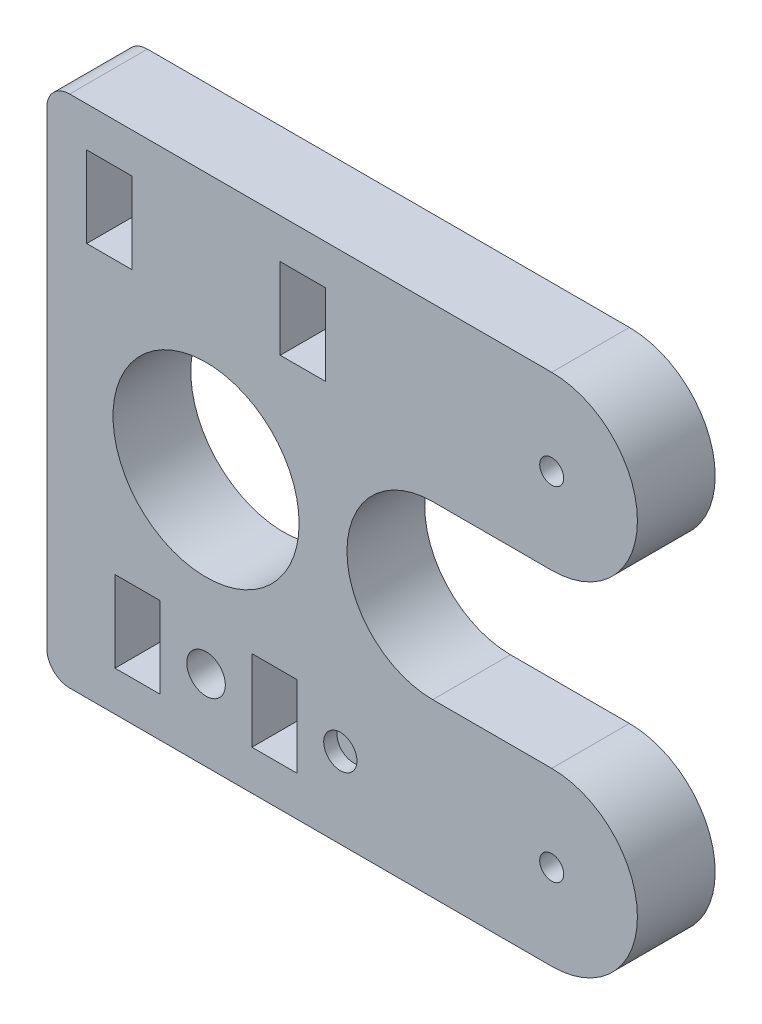
ISO-10303-21;
HEADER;
FILE_DESCRIPTION(('STEP AP214'),'2;1');
FILE_NAME('part.step','',(''),(''),'','','');
FILE_SCHEMA(('AUTOMOTIVE_DESIGN { 1 0 10303 214 1 1 1 1 }'));
ENDSEC;
DATA;
#1=APPLICATION_CONTEXT('core data for automotive mechanical design processes');
#2=APPLICATION_PROTOCOL_DEFINITION('international standard','automotive_design',2000,#1);
#3=PRODUCT_CONTEXT('',#1,'mechanical');
#4=PRODUCT('Part','Part','',(#3));
#5=PRODUCT_RELATED_PRODUCT_CATEGORY('part','',(#4));
#6=PRODUCT_DEFINITION_FORMATION('','',#4);
#7=PRODUCT_DEFINITION_CONTEXT('part definition',#1,'design');
#8=PRODUCT_DEFINITION('design','',#6,#7);
#9=PRODUCT_DEFINITION_SHAPE('','',#8);
#10=(LENGTH_UNIT() NAMED_UNIT(*) SI_UNIT(.MILLI.,.METRE.));
#11=(NAMED_UNIT(*) PLANE_ANGLE_UNIT() SI_UNIT($,.RADIAN.));
#12=(NAMED_UNIT(*) SI_UNIT($,.STERADIAN.) SOLID_ANGLE_UNIT());
#13=UNCERTAINTY_MEASURE_WITH_UNIT(LENGTH_MEASURE(1.E-05),#10,'distance_accuracy_value','');
#14=(GEOMETRIC_REPRESENTATION_CONTEXT(3) GLOBAL_UNCERTAINTY_ASSIGNED_CONTEXT((#13)) GLOBAL_UNIT_ASSIGNED_CONTEXT((#10,
#11,#12)) REPRESENTATION_CONTEXT('',''));
#15=CARTESIAN_POINT('',(0.,0.,0.));
#16=DIRECTION('',(0.,0.,1.));
#17=DIRECTION('',(1.,0.,0.));
#18=AXIS2_PLACEMENT_3D('',#15,#16,#17);
#19=CARTESIAN_POINT('',(684.72652137136,317.86545660983,5.85));
#20=DIRECTION('',(0.,0.,1.));
#21=DIRECTION('',(1.,0.,0.));
#22=AXIS2_PLACEMENT_3D('',#19,#20,#21);
#23=PLANE('',#22);
#24=CARTESIAN_POINT('',(668.82652137136,317.46545660983,5.85));
#25=DIRECTION('',(0.,0.,1.));
#26=DIRECTION('',(1.,0.,0.));
#27=AXIS2_PLACEMENT_3D('',#24,#25,#26);
#28=CIRCLE('',#27,1.24999999999996);
#29=CARTESIAN_POINT('',(670.07652137136,317.46545660983,5.85));
#30=VERTEX_POINT('',#29);
#31=EDGE_CURVE('E799',#30,#30,#28,.T.);
#32=ORIENTED_EDGE('',*,*,#31,.F.);
#33=EDGE_LOOP('',(#32));
#34=FACE_BOUND('',#33,.T.);
#35=CARTESIAN_POINT('',(658.72652137136,330.76545660983,5.85));
#36=DIRECTION('',(0.,0.,1.));
#37=DIRECTION('',(1.,0.,0.));
#38=AXIS2_PLACEMENT_3D('',#35,#36,#37);
#39=CIRCLE('',#38,7.00000000000004);
#40=CARTESIAN_POINT('',(665.72652137136,330.76545660983,5.85));
#41=VERTEX_POINT('',#40);
#42=EDGE_CURVE('E343',#41,#41,#39,.T.);
#43=ORIENTED_EDGE('',*,*,#42,.F.);
#44=EDGE_LOOP('',(#43));
#45=FACE_BOUND('',#44,.T.);
#46=CARTESIAN_POINT('',(684.72652137136,343.66545660983,5.85));
#47=DIRECTION('',(0.,0.,1.));
#48=DIRECTION('',(1.,0.,0.));
#49=AXIS2_PLACEMENT_3D('',#46,#47,#48);
#50=CIRCLE('',#49,0.900000000000007);
#51=CARTESIAN_POINT('',(685.62652137136,343.66545660983,5.85));
#52=VERTEX_POINT('',#51);
#53=EDGE_CURVE('E355',#52,#52,#50,.T.);
#54=ORIENTED_EDGE('',*,*,#53,.F.);
#55=EDGE_LOOP('',(#54));
#56=FACE_BOUND('',#55,.T.);
#57=DIRECTION('',(1.,0.,0.));
#58=VECTOR('',#57,1.);
#59=CARTESIAN_POINT('',(669.216844170212,311.41545660983,5.85));
#60=LINE('',#59,#58);
#61=CARTESIAN_POINT('',(648.463811899796,311.41545660983,5.85));
#62=VERTEX_POINT('',#61);
#63=CARTESIAN_POINT('',(684.726521371376,311.41545660983,5.85));
#64=VERTEX_POINT('',#63);
#65=EDGE_CURVE('E361',#62,#64,#60,.T.);
#66=ORIENTED_EDGE('',*,*,#65,.T.);
#67=CARTESIAN_POINT('',(684.72652137136,317.86545660983,5.85));
#68=DIRECTION('',(0.,0.,1.));
#69=DIRECTION('',(1.,0.,0.));
#70=AXIS2_PLACEMENT_3D('',#67,#68,#69);
#71=CIRCLE('',#70,6.44999999999996);
#72=CARTESIAN_POINT('',(684.726521371376,324.31545660983,5.85));
#73=VERTEX_POINT('',#72);
#74=EDGE_CURVE('E364',#64,#73,#71,.T.);
#75=ORIENTED_EDGE('',*,*,#74,.T.);
#76=DIRECTION('',(-1.,0.,0.));
#77=VECTOR('',#76,1.);
#78=CARTESIAN_POINT('',(684.726521371376,324.31545660983,5.85));
#79=LINE('',#78,#77);
#80=CARTESIAN_POINT('',(675.776521371359,324.31545660983,5.85));
#81=VERTEX_POINT('',#80);
#82=EDGE_CURVE('E367',#73,#81,#79,.T.);
#83=ORIENTED_EDGE('',*,*,#82,.T.);
#84=CARTESIAN_POINT('',(675.776521371359,330.76545660983,5.85));
#85=DIRECTION('',(0.,0.,-1.));
#86=DIRECTION('',(1.,0.,0.));
#87=AXIS2_PLACEMENT_3D('',#84,#85,#86);
#88=CIRCLE('',#87,6.45000000000007);
#89=CARTESIAN_POINT('',(675.776521371359,337.21545660983,5.85));
#90=VERTEX_POINT('',#89);
#91=EDGE_CURVE('E369',#81,#90,#88,.T.);
#92=ORIENTED_EDGE('',*,*,#91,.T.);
#93=DIRECTION('',(1.,0.,0.));
#94=VECTOR('',#93,1.);
#95=CARTESIAN_POINT('',(684.726521371376,337.21545660983,5.85));
#96=LINE('',#95,#94);
#97=CARTESIAN_POINT('',(684.726521371376,337.21545660983,5.85));
#98=VERTEX_POINT('',#97);
#99=EDGE_CURVE('E371',#90,#98,#96,.T.);
#100=ORIENTED_EDGE('',*,*,#99,.T.);
#101=CARTESIAN_POINT('',(684.72652137136,343.66545660983,5.85));
#102=DIRECTION('',(0.,0.,1.));
#103=DIRECTION('',(-1.,0.,0.));
#104=AXIS2_PLACEMENT_3D('',#101,#102,#103);
#105=CIRCLE('',#104,6.44999999999996);
#106=CARTESIAN_POINT('',(684.726521371376,350.11545660983,5.85));
#107=VERTEX_POINT('',#106);
#108=EDGE_CURVE('E373',#98,#107,#105,.T.);
#109=ORIENTED_EDGE('',*,*,#108,.T.);
#110=DIRECTION('',(-1.,0.,0.));
#111=VECTOR('',#110,1.);
#112=CARTESIAN_POINT('',(669.21684417021,350.11545660983,5.85));
#113=LINE('',#112,#111);
#114=CARTESIAN_POINT('',(648.463811899796,350.11545660983,5.85));
#115=VERTEX_POINT('',#114);
#116=EDGE_CURVE('E375',#107,#115,#113,.T.);
#117=ORIENTED_EDGE('',*,*,#116,.T.);
#118=CARTESIAN_POINT('',(648.463811899796,348.398155081394,5.85));
#119=DIRECTION('',(0.,0.,1.));
#120=DIRECTION('',(1.,0.,0.));
#121=AXIS2_PLACEMENT_3D('',#118,#119,#120);
#122=CIRCLE('',#121,1.71730152843566);
#123=CARTESIAN_POINT('',(646.74651037136,348.398155081394,5.85));
#124=VERTEX_POINT('',#123);
#125=EDGE_CURVE('E377',#115,#124,#122,.T.);
#126=ORIENTED_EDGE('',*,*,#125,.T.);
#127=DIRECTION('',(0.,-1.,0.));
#128=VECTOR('',#127,1.);
#129=CARTESIAN_POINT('',(646.74651037136,348.398155081394,5.85));
#130=LINE('',#129,#128);
#131=CARTESIAN_POINT('',(646.74651037136,313.132758138266,5.85));
#132=VERTEX_POINT('',#131);
#133=EDGE_CURVE('E379',#124,#132,#130,.T.);
#134=ORIENTED_EDGE('',*,*,#133,.T.);
#135=CARTESIAN_POINT('',(648.463811899796,313.132758138266,5.85));
#136=DIRECTION('',(0.,0.,1.));
#137=DIRECTION('',(1.,0.,0.));
#138=AXIS2_PLACEMENT_3D('',#135,#136,#137);
#139=CIRCLE('',#138,1.71730152843566);
#140=EDGE_CURVE('E381',#132,#62,#139,.T.);
#141=ORIENTED_EDGE('',*,*,#140,.T.);
#142=EDGE_LOOP('',(#66,#75,#83,#92,#100,#109,#117,#126,#134,#141));
#143=FACE_BOUND('',#142,.T.);
#144=CARTESIAN_POINT('',(658.72652137136,317.46545660983,5.85));
#145=DIRECTION('',(0.,0.,1.));
#146=DIRECTION('',(1.,0.,0.));
#147=AXIS2_PLACEMENT_3D('',#144,#145,#146);
#148=CIRCLE('',#147,1.44999999999994);
#149=CARTESIAN_POINT('',(660.17652137136,317.46545660983,5.85));
#150=VERTEX_POINT('',#149);
#151=EDGE_CURVE('E349',#150,#150,#148,.T.);
#152=ORIENTED_EDGE('',*,*,#151,.F.);
#153=EDGE_LOOP('',(#152));
#154=FACE_BOUND('',#153,.T.);
#155=CARTESIAN_POINT('',(684.72652137136,317.86545660983,5.85));
#156=DIRECTION('',(0.,0.,1.));
#157=DIRECTION('',(1.,0.,0.));
#158=AXIS2_PLACEMENT_3D('',#155,#156,#157);
#159=CIRCLE('',#158,0.900000000000007);
#160=CARTESIAN_POINT('',(685.62652137136,317.86545660983,5.85));
#161=VERTEX_POINT('',#160);
#162=EDGE_CURVE('E337',#161,#161,#159,.T.);
#163=ORIENTED_EDGE('',*,*,#162,.F.);
#164=EDGE_LOOP('',(#163));
#165=FACE_BOUND('',#164,.T.);
#166=DIRECTION('',(0.,1.,0.));
#167=VECTOR('',#166,1.);
#168=CARTESIAN_POINT('',(653.14652137136,341.01545660983,5.85));
#169=LINE('',#168,#167);
#170=CARTESIAN_POINT('',(653.14652137136,341.01545660983,5.85));
#171=VERTEX_POINT('',#170);
#172=CARTESIAN_POINT('',(653.14652137136,347.11545660983,5.85));
#173=VERTEX_POINT('',#172);
#174=EDGE_CURVE('E308',#171,#173,#169,.T.);
#175=ORIENTED_EDGE('',*,*,#174,.F.);
#176=DIRECTION('',(1.,0.,0.));
#177=VECTOR('',#176,1.);
#178=CARTESIAN_POINT('',(649.74651037136,341.01545660983,5.85));
#179=LINE('',#178,#177);
#180=CARTESIAN_POINT('',(649.74651037136,341.01545660983,5.85));
#181=VERTEX_POINT('',#180);
#182=EDGE_CURVE('E306',#181,#171,#179,.T.);
#183=ORIENTED_EDGE('',*,*,#182,.F.);
#184=DIRECTION('',(0.,-1.,0.));
#185=VECTOR('',#184,1.);
#186=CARTESIAN_POINT('',(649.74651037136,347.11545660983,5.85));
#187=LINE('',#186,#185);
#188=CARTESIAN_POINT('',(649.74651037136,347.11545660983,5.85));
#189=VERTEX_POINT('',#188);
#190=EDGE_CURVE('E314',#189,#181,#187,.T.);
#191=ORIENTED_EDGE('',*,*,#190,.F.);
#192=DIRECTION('',(-1.,0.,0.));
#193=VECTOR('',#192,1.);
#194=CARTESIAN_POINT('',(653.14652137136,347.11545660983,5.85));
#195=LINE('',#194,#193);
#196=EDGE_CURVE('E311',#173,#189,#195,.T.);
#197=ORIENTED_EDGE('',*,*,#196,.F.);
#198=EDGE_LOOP('',(#175,#183,#191,#197));
#199=FACE_BOUND('',#198,.T.);
#200=DIRECTION('',(1.,0.,0.));
#201=VECTOR('',#200,1.);
#202=CARTESIAN_POINT('',(651.87652137136,314.41545660983,5.85));
#203=LINE('',#202,#201);
#204=CARTESIAN_POINT('',(651.87652137136,314.41545660983,5.85));
#205=VERTEX_POINT('',#204);
#206=CARTESIAN_POINT('',(655.27652137136,314.41545660983,5.85));
#207=VERTEX_POINT('',#206);
#208=EDGE_CURVE('E277',#205,#207,#203,.T.);
#209=ORIENTED_EDGE('',*,*,#208,.F.);
#210=DIRECTION('',(0.,-1.,0.));
#211=VECTOR('',#210,1.);
#212=CARTESIAN_POINT('',(651.87652137136,320.51545660983,5.85));
#213=LINE('',#212,#211);
#214=CARTESIAN_POINT('',(651.87652137136,320.51545660983,5.85));
#215=VERTEX_POINT('',#214);
#216=EDGE_CURVE('E275',#215,#205,#213,.T.);
#217=ORIENTED_EDGE('',*,*,#216,.F.);
#218=DIRECTION('',(-1.,0.,0.));
#219=VECTOR('',#218,1.);
#220=CARTESIAN_POINT('',(655.27652137136,320.51545660983,5.85));
#221=LINE('',#220,#219);
#222=CARTESIAN_POINT('',(655.27652137136,320.51545660983,5.85));
#223=VERTEX_POINT('',#222);
#224=EDGE_CURVE('E283',#223,#215,#221,.T.);
#225=ORIENTED_EDGE('',*,*,#224,.F.);
#226=DIRECTION('',(0.,1.,0.));
#227=VECTOR('',#226,1.);
#228=CARTESIAN_POINT('',(655.27652137136,314.41545660983,5.85));
#229=LINE('',#228,#227);
#230=EDGE_CURVE('E280',#207,#223,#229,.T.);
#231=ORIENTED_EDGE('',*,*,#230,.F.);
#232=EDGE_LOOP('',(#209,#217,#225,#231));
#233=FACE_BOUND('',#232,.T.);
#234=DIRECTION('',(0.,1.,0.));
#235=VECTOR('',#234,1.);
#236=CARTESIAN_POINT('',(667.70653237136,341.01545660983,5.85));
#237=LINE('',#236,#235);
#238=CARTESIAN_POINT('',(667.70653237136,341.01545660983,5.85));
#239=VERTEX_POINT('',#238);
#240=CARTESIAN_POINT('',(667.70653237136,347.11545660983,5.85));
#241=VERTEX_POINT('',#240);
#242=EDGE_CURVE('E246',#239,#241,#237,.T.);
#243=ORIENTED_EDGE('',*,*,#242,.F.);
#244=DIRECTION('',(1.,0.,0.));
#245=VECTOR('',#244,1.);
#246=CARTESIAN_POINT('',(664.30652137136,341.01545660983,5.85));
#247=LINE('',#246,#245);
#248=CARTESIAN_POINT('',(664.30652137136,341.01545660983,5.85));
#249=VERTEX_POINT('',#248);
#250=EDGE_CURVE('E244',#249,#239,#247,.T.);
#251=ORIENTED_EDGE('',*,*,#250,.F.);
#252=DIRECTION('',(0.,-1.,0.));
#253=VECTOR('',#252,1.);
#254=CARTESIAN_POINT('',(664.30652137136,347.11545660983,5.85));
#255=LINE('',#254,#253);
#256=CARTESIAN_POINT('',(664.30652137136,347.11545660983,5.85));
#257=VERTEX_POINT('',#256);
#258=EDGE_CURVE('E252',#257,#249,#255,.T.);
#259=ORIENTED_EDGE('',*,*,#258,.F.);
#260=DIRECTION('',(-1.,0.,0.));
#261=VECTOR('',#260,1.);
#262=CARTESIAN_POINT('',(667.70653237136,347.11545660983,5.85));
#263=LINE('',#262,#261);
#264=EDGE_CURVE('E249',#241,#257,#263,.T.);
#265=ORIENTED_EDGE('',*,*,#264,.F.);
#266=EDGE_LOOP('',(#243,#251,#259,#265));
#267=FACE_BOUND('',#266,.T.);
#268=DIRECTION('',(0.,-1.,0.));
#269=VECTOR('',#268,1.);
#270=CARTESIAN_POINT('',(662.17652137136,320.51545660983,5.85));
#271=LINE('',#270,#269);
#272=CARTESIAN_POINT('',(662.17652137136,320.51545660983,5.85));
#273=VERTEX_POINT('',#272);
#274=CARTESIAN_POINT('',(662.17652137136,314.41545660983,5.85));
#275=VERTEX_POINT('',#274);
#276=EDGE_CURVE('E214',#273,#275,#271,.T.);
#277=ORIENTED_EDGE('',*,*,#276,.F.);
#278=DIRECTION('',(-1.,0.,0.));
#279=VECTOR('',#278,1.);
#280=CARTESIAN_POINT('',(665.57652137136,320.51545660983,5.85));
#281=LINE('',#280,#279);
#282=CARTESIAN_POINT('',(665.57652137136,320.51545660983,5.85));
#283=VERTEX_POINT('',#282);
#284=EDGE_CURVE('E206',#283,#273,#281,.T.);
#285=ORIENTED_EDGE('',*,*,#284,.F.);
#286=DIRECTION('',(0.,1.,0.));
#287=VECTOR('',#286,1.);
#288=CARTESIAN_POINT('',(665.57652137136,314.41545660983,5.85));
#289=LINE('',#288,#287);
#290=CARTESIAN_POINT('',(665.57652137136,314.41545660983,5.85));
#291=VERTEX_POINT('',#290);
#292=EDGE_CURVE('E228',#291,#283,#289,.T.);
#293=ORIENTED_EDGE('',*,*,#292,.F.);
#294=DIRECTION('',(1.,0.,0.));
#295=VECTOR('',#294,1.);
#296=CARTESIAN_POINT('',(662.17652137136,314.41545660983,5.85));
#297=LINE('',#296,#295);
#298=EDGE_CURVE('E226',#275,#291,#297,.T.);
#299=ORIENTED_EDGE('',*,*,#298,.F.);
#300=EDGE_LOOP('',(#277,#285,#293,#299));
#301=FACE_BOUND('',#300,.T.);
#302=ADVANCED_FACE('F33',(#34,#45,#56,#143,#154,#165,#199,#233,#267,#301),#23,.T.);
#303=CARTESIAN_POINT('',(684.72652137136,317.86545660983,0.));
#304=DIRECTION('',(0.,0.,1.));
#305=DIRECTION('',(1.,0.,0.));
#306=AXIS2_PLACEMENT_3D('',#303,#304,#305);
#307=PLANE('',#306);
#308=DIRECTION('',(1.,0.,0.));
#309=VECTOR('',#308,1.);
#310=CARTESIAN_POINT('',(664.30652137136,341.01545660983,0.));
#311=LINE('',#310,#309);
#312=CARTESIAN_POINT('',(664.30652137136,341.01545660983,0.));
#313=VERTEX_POINT('',#312);
#314=CARTESIAN_POINT('',(667.70653237136,341.01545660983,0.));
#315=VERTEX_POINT('',#314);
#316=EDGE_CURVE('E222',#313,#315,#311,.T.);
#317=ORIENTED_EDGE('',*,*,#316,.T.);
#318=DIRECTION('',(0.,1.,0.));
#319=VECTOR('',#318,1.);
#320=CARTESIAN_POINT('',(667.70653237136,341.01545660983,0.));
#321=LINE('',#320,#319);
#322=CARTESIAN_POINT('',(667.70653237136,347.11545660983,0.));
#323=VERTEX_POINT('',#322);
#324=EDGE_CURVE('E257',#315,#323,#321,.T.);
#325=ORIENTED_EDGE('',*,*,#324,.T.);
#326=DIRECTION('',(-1.,0.,0.));
#327=VECTOR('',#326,1.);
#328=CARTESIAN_POINT('',(667.70653237136,347.11545660983,0.));
#329=LINE('',#328,#327);
#330=CARTESIAN_POINT('',(664.30652137136,347.11545660983,0.));
#331=VERTEX_POINT('',#330);
#332=EDGE_CURVE('E260',#323,#331,#329,.T.);
#333=ORIENTED_EDGE('',*,*,#332,.T.);
#334=DIRECTION('',(0.,-1.,0.));
#335=VECTOR('',#334,1.);
#336=CARTESIAN_POINT('',(664.30652137136,347.11545660983,0.));
#337=LINE('',#336,#335);
#338=EDGE_CURVE('E247',#331,#313,#337,.T.);
#339=ORIENTED_EDGE('',*,*,#338,.T.);
#340=EDGE_LOOP('',(#317,#325,#333,#339));
#341=FACE_BOUND('',#340,.T.);
#342=DIRECTION('',(1.,0.,0.));
#343=VECTOR('',#342,1.);
#344=CARTESIAN_POINT('',(649.74651037136,341.01545660983,0.));
#345=LINE('',#344,#343);
#346=CARTESIAN_POINT('',(649.74651037136,341.01545660983,0.));
#347=VERTEX_POINT('',#346);
#348=CARTESIAN_POINT('',(653.14652137136,341.01545660983,0.));
#349=VERTEX_POINT('',#348);
#350=EDGE_CURVE('E305',#347,#349,#345,.T.);
#351=ORIENTED_EDGE('',*,*,#350,.T.);
#352=DIRECTION('',(0.,1.,0.));
#353=VECTOR('',#352,1.);
#354=CARTESIAN_POINT('',(653.14652137136,341.01545660983,0.));
#355=LINE('',#354,#353);
#356=CARTESIAN_POINT('',(653.14652137136,347.11545660983,0.));
#357=VERTEX_POINT('',#356);
#358=EDGE_CURVE('E319',#349,#357,#355,.T.);
#359=ORIENTED_EDGE('',*,*,#358,.T.);
#360=DIRECTION('',(-1.,0.,0.));
#361=VECTOR('',#360,1.);
#362=CARTESIAN_POINT('',(653.14652137136,347.11545660983,0.));
#363=LINE('',#362,#361);
#364=CARTESIAN_POINT('',(649.74651037136,347.11545660983,0.));
#365=VERTEX_POINT('',#364);
#366=EDGE_CURVE('E322',#357,#365,#363,.T.);
#367=ORIENTED_EDGE('',*,*,#366,.T.);
#368=DIRECTION('',(0.,-1.,0.));
#369=VECTOR('',#368,1.);
#370=CARTESIAN_POINT('',(649.74651037136,347.11545660983,0.));
#371=LINE('',#370,#369);
#372=EDGE_CURVE('E309',#365,#347,#371,.T.);
#373=ORIENTED_EDGE('',*,*,#372,.T.);
#374=EDGE_LOOP('',(#351,#359,#367,#373));
#375=FACE_BOUND('',#374,.T.);
#376=CARTESIAN_POINT('',(684.72652137136,317.86545660983,0.));
#377=DIRECTION('',(0.,0.,1.));
#378=DIRECTION('',(1.,0.,0.));
#379=AXIS2_PLACEMENT_3D('',#376,#377,#378);
#380=CIRCLE('',#379,6.44999999999996);
#381=CARTESIAN_POINT('',(684.726521371376,311.41545660983,0.));
#382=VERTEX_POINT('',#381);
#383=CARTESIAN_POINT('',(684.726521371376,324.31545660983,0.));
#384=VERTEX_POINT('',#383);
#385=EDGE_CURVE('E358',#382,#384,#380,.T.);
#386=ORIENTED_EDGE('',*,*,#385,.F.);
#387=DIRECTION('',(1.,0.,0.));
#388=VECTOR('',#387,1.);
#389=CARTESIAN_POINT('',(648.463811899796,311.41545660983,0.));
#390=LINE('',#389,#388);
#391=CARTESIAN_POINT('',(648.463811899796,311.41545660983,0.));
#392=VERTEX_POINT('',#391);
#393=EDGE_CURVE('E365',#392,#382,#390,.T.);
#394=ORIENTED_EDGE('',*,*,#393,.F.);
#395=CARTESIAN_POINT('',(648.463811899796,313.132758138266,0.));
#396=DIRECTION('',(0.,0.,1.));
#397=DIRECTION('',(1.,0.,0.));
#398=AXIS2_PLACEMENT_3D('',#395,#396,#397);
#399=CIRCLE('',#398,1.71730152843566);
#400=CARTESIAN_POINT('',(646.74651037136,313.132758138266,0.));
#401=VERTEX_POINT('',#400);
#402=EDGE_CURVE('E401',#401,#392,#399,.T.);
#403=ORIENTED_EDGE('',*,*,#402,.F.);
#404=DIRECTION('',(0.,-1.,0.));
#405=VECTOR('',#404,1.);
#406=CARTESIAN_POINT('',(646.74651037136,348.398155081394,0.));
#407=LINE('',#406,#405);
#408=CARTESIAN_POINT('',(646.74651037136,348.398155081394,0.));
#409=VERTEX_POINT('',#408);
#410=EDGE_CURVE('E399',#409,#401,#407,.T.);
#411=ORIENTED_EDGE('',*,*,#410,.F.);
#412=CARTESIAN_POINT('',(648.463811899796,348.398155081394,0.));
#413=DIRECTION('',(0.,0.,1.));
#414=DIRECTION('',(1.,0.,0.));
#415=AXIS2_PLACEMENT_3D('',#412,#413,#414);
#416=CIRCLE('',#415,1.71730152843566);
#417=CARTESIAN_POINT('',(648.463811899796,350.11545660983,0.));
#418=VERTEX_POINT('',#417);
#419=EDGE_CURVE('E397',#418,#409,#416,.T.);
#420=ORIENTED_EDGE('',*,*,#419,.F.);
#421=DIRECTION('',(-1.,0.,0.));
#422=VECTOR('',#421,1.);
#423=CARTESIAN_POINT('',(669.21684417021,350.11545660983,0.));
#424=LINE('',#423,#422);
#425=CARTESIAN_POINT('',(684.726521371376,350.11545660983,0.));
#426=VERTEX_POINT('',#425);
#427=EDGE_CURVE('E395',#426,#418,#424,.T.);
#428=ORIENTED_EDGE('',*,*,#427,.F.);
#429=CARTESIAN_POINT('',(684.72652137136,343.66545660983,0.));
#430=DIRECTION('',(0.,0.,1.));
#431=DIRECTION('',(-1.,0.,0.));
#432=AXIS2_PLACEMENT_3D('',#429,#430,#431);
#433=CIRCLE('',#432,6.44999999999996);
#434=CARTESIAN_POINT('',(684.726521371376,337.21545660983,0.));
#435=VERTEX_POINT('',#434);
#436=EDGE_CURVE('E392',#435,#426,#433,.T.);
#437=ORIENTED_EDGE('',*,*,#436,.F.);
#438=DIRECTION('',(1.,0.,0.));
#439=VECTOR('',#438,1.);
#440=CARTESIAN_POINT('',(684.726521371376,337.21545660983,0.));
#441=LINE('',#440,#439);
#442=CARTESIAN_POINT('',(675.776521371359,337.21545660983,0.));
#443=VERTEX_POINT('',#442);
#444=EDGE_CURVE('E390',#443,#435,#441,.T.);
#445=ORIENTED_EDGE('',*,*,#444,.F.);
#446=CARTESIAN_POINT('',(675.776521371359,330.76545660983,0.));
#447=DIRECTION('',(0.,0.,-1.));
#448=DIRECTION('',(1.,0.,0.));
#449=AXIS2_PLACEMENT_3D('',#446,#447,#448);
#450=CIRCLE('',#449,6.45000000000007);
#451=CARTESIAN_POINT('',(675.776521371359,324.31545660983,0.));
#452=VERTEX_POINT('',#451);
#453=EDGE_CURVE('E388',#452,#443,#450,.T.);
#454=ORIENTED_EDGE('',*,*,#453,.F.);
#455=DIRECTION('',(-1.,0.,0.));
#456=VECTOR('',#455,1.);
#457=CARTESIAN_POINT('',(684.726521371376,324.31545660983,0.));
#458=LINE('',#457,#456);
#459=EDGE_CURVE('E386',#384,#452,#458,.T.);
#460=ORIENTED_EDGE('',*,*,#459,.F.);
#461=EDGE_LOOP('',(#386,#394,#403,#411,#420,#428,#437,#445,#454,#460));
#462=FACE_BOUND('',#461,.T.);
#463=CARTESIAN_POINT('',(684.72652137136,343.66545660983,0.));
#464=DIRECTION('',(0.,0.,1.));
#465=DIRECTION('',(1.,0.,0.));
#466=AXIS2_PLACEMENT_3D('',#463,#464,#465);
#467=CIRCLE('',#466,0.900000000000007);
#468=CARTESIAN_POINT('',(685.62652137136,343.66545660983,0.));
#469=VERTEX_POINT('',#468);
#470=EDGE_CURVE('E352',#469,#469,#467,.T.);
#471=ORIENTED_EDGE('',*,*,#470,.T.);
#472=EDGE_LOOP('',(#471));
#473=FACE_BOUND('',#472,.T.);
#474=CARTESIAN_POINT('',(658.72652137136,317.46545660983,0.));
#475=DIRECTION('',(0.,0.,1.));
#476=DIRECTION('',(1.,0.,0.));
#477=AXIS2_PLACEMENT_3D('',#474,#475,#476);
#478=CIRCLE('',#477,1.44999999999994);
#479=CARTESIAN_POINT('',(660.17652137136,317.46545660983,0.));
#480=VERTEX_POINT('',#479);
#481=EDGE_CURVE('E346',#480,#480,#478,.T.);
#482=ORIENTED_EDGE('',*,*,#481,.T.);
#483=EDGE_LOOP('',(#482));
#484=FACE_BOUND('',#483,.T.);
#485=CARTESIAN_POINT('',(658.72652137136,330.76545660983,0.));
#486=DIRECTION('',(0.,0.,1.));
#487=DIRECTION('',(1.,0.,0.));
#488=AXIS2_PLACEMENT_3D('',#485,#486,#487);
#489=CIRCLE('',#488,7.00000000000004);
#490=CARTESIAN_POINT('',(665.72652137136,330.76545660983,0.));
#491=VERTEX_POINT('',#490);
#492=EDGE_CURVE('E340',#491,#491,#489,.T.);
#493=ORIENTED_EDGE('',*,*,#492,.T.);
#494=EDGE_LOOP('',(#493));
#495=FACE_BOUND('',#494,.T.);
#496=CARTESIAN_POINT('',(684.72652137136,317.86545660983,0.));
#497=DIRECTION('',(0.,0.,1.));
#498=DIRECTION('',(1.,0.,0.));
#499=AXIS2_PLACEMENT_3D('',#496,#497,#498);
#500=CIRCLE('',#499,0.900000000000007);
#501=CARTESIAN_POINT('',(685.62652137136,317.86545660983,0.));
#502=VERTEX_POINT('',#501);
#503=EDGE_CURVE('E336',#502,#502,#500,.T.);
#504=ORIENTED_EDGE('',*,*,#503,.T.);
#505=EDGE_LOOP('',(#504));
#506=FACE_BOUND('',#505,.T.);
#507=DIRECTION('',(0.,-1.,0.));
#508=VECTOR('',#507,1.);
#509=CARTESIAN_POINT('',(651.87652137136,320.51545660983,0.));
#510=LINE('',#509,#508);
#511=CARTESIAN_POINT('',(651.87652137136,320.51545660983,0.));
#512=VERTEX_POINT('',#511);
#513=CARTESIAN_POINT('',(651.87652137136,314.41545660983,0.));
#514=VERTEX_POINT('',#513);
#515=EDGE_CURVE('E274',#512,#514,#510,.T.);
#516=ORIENTED_EDGE('',*,*,#515,.T.);
#517=DIRECTION('',(1.,0.,0.));
#518=VECTOR('',#517,1.);
#519=CARTESIAN_POINT('',(651.87652137136,314.41545660983,0.));
#520=LINE('',#519,#518);
#521=CARTESIAN_POINT('',(655.27652137136,314.41545660983,0.));
#522=VERTEX_POINT('',#521);
#523=EDGE_CURVE('E288',#514,#522,#520,.T.);
#524=ORIENTED_EDGE('',*,*,#523,.T.);
#525=DIRECTION('',(0.,1.,0.));
#526=VECTOR('',#525,1.);
#527=CARTESIAN_POINT('',(655.27652137136,314.41545660983,0.));
#528=LINE('',#527,#526);
#529=CARTESIAN_POINT('',(655.27652137136,320.51545660983,0.));
#530=VERTEX_POINT('',#529);
#531=EDGE_CURVE('E291',#522,#530,#528,.T.);
#532=ORIENTED_EDGE('',*,*,#531,.T.);
#533=DIRECTION('',(-1.,0.,0.));
#534=VECTOR('',#533,1.);
#535=CARTESIAN_POINT('',(655.27652137136,320.51545660983,0.));
#536=LINE('',#535,#534);
#537=EDGE_CURVE('E278',#530,#512,#536,.T.);
#538=ORIENTED_EDGE('',*,*,#537,.T.);
#539=EDGE_LOOP('',(#516,#524,#532,#538));
#540=FACE_BOUND('',#539,.T.);
#541=DIRECTION('',(-1.,0.,0.));
#542=VECTOR('',#541,1.);
#543=CARTESIAN_POINT('',(665.57652137136,320.51545660983,0.));
#544=LINE('',#543,#542);
#545=CARTESIAN_POINT('',(665.57652137136,320.51545660983,0.));
#546=VERTEX_POINT('',#545);
#547=CARTESIAN_POINT('',(662.17652137136,320.51545660983,0.));
#548=VERTEX_POINT('',#547);
#549=EDGE_CURVE('E56',#546,#548,#544,.T.);
#550=ORIENTED_EDGE('',*,*,#549,.T.);
#551=DIRECTION('',(0.,-1.,0.));
#552=VECTOR('',#551,1.);
#553=CARTESIAN_POINT('',(662.17652137136,320.51545660983,0.));
#554=LINE('',#553,#552);
#555=CARTESIAN_POINT('',(662.17652137136,314.41545660983,0.));
#556=VERTEX_POINT('',#555);
#557=EDGE_CURVE('E221',#548,#556,#554,.T.);
#558=ORIENTED_EDGE('',*,*,#557,.T.);
#559=DIRECTION('',(1.,0.,0.));
#560=VECTOR('',#559,1.);
#561=CARTESIAN_POINT('',(662.17652137136,314.41545660983,0.));
#562=LINE('',#561,#560);
#563=CARTESIAN_POINT('',(665.57652137136,314.41545660983,0.));
#564=VERTEX_POINT('',#563);
#565=EDGE_CURVE('E236',#556,#564,#562,.T.);
#566=ORIENTED_EDGE('',*,*,#565,.T.);
#567=DIRECTION('',(0.,1.,0.));
#568=VECTOR('',#567,1.);
#569=CARTESIAN_POINT('',(665.57652137136,314.41545660983,0.));
#570=LINE('',#569,#568);
#571=EDGE_CURVE('E215',#564,#546,#570,.T.);
#572=ORIENTED_EDGE('',*,*,#571,.T.);
#573=EDGE_LOOP('',(#550,#558,#566,#572));
#574=FACE_BOUND('',#573,.T.);
#575=ADVANCED_FACE('F437',(#341,#375,#462,#473,#484,#495,#506,#540,#574),#307,.F.);
#576=CARTESIAN_POINT('',(684.72652137136,317.86545660983,5.85));
#577=DIRECTION('',(0.,0.,-1.));
#578=DIRECTION('',(-1.,0.,0.));
#579=AXIS2_PLACEMENT_3D('',#576,#577,#578);
#580=CYLINDRICAL_SURFACE('',#579,6.44999999999996);
#581=ORIENTED_EDGE('',*,*,#385,.T.);
#582=DIRECTION('',(0.,0.,-1.));
#583=VECTOR('',#582,1.);
#584=CARTESIAN_POINT('',(684.726521371376,324.31545660983,5.85));
#585=LINE('',#584,#583);
#586=EDGE_CURVE('E41',#73,#384,#585,.T.);
#587=ORIENTED_EDGE('',*,*,#586,.F.);
#588=ORIENTED_EDGE('',*,*,#74,.F.);
#589=DIRECTION('',(0.,0.,-1.));
#590=VECTOR('',#589,1.);
#591=CARTESIAN_POINT('',(684.726521371376,311.41545660983,5.85));
#592=LINE('',#591,#590);
#593=EDGE_CURVE('E11',#64,#382,#592,.T.);
#594=ORIENTED_EDGE('',*,*,#593,.T.);
#595=EDGE_LOOP('',(#581,#587,#588,#594));
#596=FACE_BOUND('',#595,.T.);
#597=ADVANCED_FACE('F35',(#596),#580,.T.);
#598=CARTESIAN_POINT('',(684.726521371376,324.31545660983,5.85));
#599=DIRECTION('',(0.,-1.,0.));
#600=DIRECTION('',(0.,0.,-1.));
#601=AXIS2_PLACEMENT_3D('',#598,#599,#600);
#602=PLANE('',#601);
#603=ORIENTED_EDGE('',*,*,#459,.T.);
#604=DIRECTION('',(0.,0.,-1.));
#605=VECTOR('',#604,1.);
#606=CARTESIAN_POINT('',(675.776521371359,324.31545660983,5.85));
#607=LINE('',#606,#605);
#608=EDGE_CURVE('E424',#81,#452,#607,.T.);
#609=ORIENTED_EDGE('',*,*,#608,.F.);
#610=ORIENTED_EDGE('',*,*,#82,.F.);
#611=ORIENTED_EDGE('',*,*,#586,.T.);
#612=EDGE_LOOP('',(#603,#609,#610,#611));
#613=FACE_BOUND('',#612,.T.);
#614=ADVANCED_FACE('F431',(#613),#602,.F.);
#615=CARTESIAN_POINT('',(675.776521371359,330.76545660983,5.85));
#616=DIRECTION('',(0.,0.,-1.));
#617=DIRECTION('',(-1.,0.,0.));
#618=AXIS2_PLACEMENT_3D('',#615,#616,#617);
#619=CYLINDRICAL_SURFACE('',#618,6.45000000000007);
#620=ORIENTED_EDGE('',*,*,#453,.T.);
#621=DIRECTION('',(0.,0.,-1.));
#622=VECTOR('',#621,1.);
#623=CARTESIAN_POINT('',(675.776521371359,337.21545660983,5.85));
#624=LINE('',#623,#622);
#625=EDGE_CURVE('E421',#90,#443,#624,.T.);
#626=ORIENTED_EDGE('',*,*,#625,.F.);
#627=ORIENTED_EDGE('',*,*,#91,.F.);
#628=ORIENTED_EDGE('',*,*,#608,.T.);
#629=EDGE_LOOP('',(#620,#626,#627,#628));
#630=FACE_BOUND('',#629,.T.);
#631=ADVANCED_FACE('F444',(#630),#619,.F.);
#632=CARTESIAN_POINT('',(684.726521371376,337.21545660983,5.85));
#633=DIRECTION('',(0.,1.,0.));
#634=DIRECTION('',(0.,0.,1.));
#635=AXIS2_PLACEMENT_3D('',#632,#633,#634);
#636=PLANE('',#635);
#637=ORIENTED_EDGE('',*,*,#444,.T.);
#638=DIRECTION('',(0.,0.,-1.));
#639=VECTOR('',#638,1.);
#640=CARTESIAN_POINT('',(684.726521371376,337.21545660983,5.85));
#641=LINE('',#640,#639);
#642=EDGE_CURVE('E418',#98,#435,#641,.T.);
#643=ORIENTED_EDGE('',*,*,#642,.F.);
#644=ORIENTED_EDGE('',*,*,#99,.F.);
#645=ORIENTED_EDGE('',*,*,#625,.T.);
#646=EDGE_LOOP('',(#637,#643,#644,#645));
#647=FACE_BOUND('',#646,.T.);
#648=ADVANCED_FACE('F448',(#647),#636,.F.);
#649=CARTESIAN_POINT('',(684.72652137136,343.66545660983,5.85));
#650=DIRECTION('',(0.,0.,-1.));
#651=DIRECTION('',(-1.,0.,0.));
#652=AXIS2_PLACEMENT_3D('',#649,#650,#651);
#653=CYLINDRICAL_SURFACE('',#652,6.44999999999996);
#654=ORIENTED_EDGE('',*,*,#436,.T.);
#655=DIRECTION('',(0.,0.,-1.));
#656=VECTOR('',#655,1.);
#657=CARTESIAN_POINT('',(684.726521371376,350.11545660983,5.85));
#658=LINE('',#657,#656);
#659=EDGE_CURVE('E415',#107,#426,#658,.T.);
#660=ORIENTED_EDGE('',*,*,#659,.F.);
#661=ORIENTED_EDGE('',*,*,#108,.F.);
#662=ORIENTED_EDGE('',*,*,#642,.T.);
#663=EDGE_LOOP('',(#654,#660,#661,#662));
#664=FACE_BOUND('',#663,.T.);
#665=ADVANCED_FACE('F475',(#664),#653,.T.);
#666=CARTESIAN_POINT('',(669.21684417021,350.11545660983,5.85));
#667=DIRECTION('',(0.,-1.,0.));
#668=DIRECTION('',(1.,0.,0.));
#669=AXIS2_PLACEMENT_3D('',#666,#667,#668);
#670=PLANE('',#669);
#671=ORIENTED_EDGE('',*,*,#427,.T.);
#672=DIRECTION('',(0.,0.,-1.));
#673=VECTOR('',#672,1.);
#674=CARTESIAN_POINT('',(648.463811899796,350.11545660983,5.85));
#675=LINE('',#674,#673);
#676=EDGE_CURVE('E412',#115,#418,#675,.T.);
#677=ORIENTED_EDGE('',*,*,#676,.F.);
#678=ORIENTED_EDGE('',*,*,#116,.F.);
#679=ORIENTED_EDGE('',*,*,#659,.T.);
#680=EDGE_LOOP('',(#671,#677,#678,#679));
#681=FACE_BOUND('',#680,.T.);
#682=ADVANCED_FACE('F477',(#681),#670,.F.);
#683=CARTESIAN_POINT('',(648.463811899796,348.398155081394,5.85));
#684=DIRECTION('',(0.,0.,-1.));
#685=DIRECTION('',(-1.,0.,0.));
#686=AXIS2_PLACEMENT_3D('',#683,#684,#685);
#687=CYLINDRICAL_SURFACE('',#686,1.71730152843566);
#688=ORIENTED_EDGE('',*,*,#419,.T.);
#689=DIRECTION('',(0.,0.,-1.));
#690=VECTOR('',#689,1.);
#691=CARTESIAN_POINT('',(646.74651037136,348.398155081394,5.85));
#692=LINE('',#691,#690);
#693=EDGE_CURVE('E409',#124,#409,#692,.T.);
#694=ORIENTED_EDGE('',*,*,#693,.F.);
#695=ORIENTED_EDGE('',*,*,#125,.F.);
#696=ORIENTED_EDGE('',*,*,#676,.T.);
#697=EDGE_LOOP('',(#688,#694,#695,#696));
#698=FACE_BOUND('',#697,.T.);
#699=ADVANCED_FACE('F471',(#698),#687,.T.);
#700=CARTESIAN_POINT('',(646.74651037136,348.398155081394,5.85));
#701=DIRECTION('',(1.,0.,0.));
#702=DIRECTION('',(0.,0.,-1.));
#703=AXIS2_PLACEMENT_3D('',#700,#701,#702);
#704=PLANE('',#703);
#705=ORIENTED_EDGE('',*,*,#410,.T.);
#706=DIRECTION('',(0.,0.,-1.));
#707=VECTOR('',#706,1.);
#708=CARTESIAN_POINT('',(646.74651037136,313.132758138266,5.85));
#709=LINE('',#708,#707);
#710=EDGE_CURVE('E406',#132,#401,#709,.T.);
#711=ORIENTED_EDGE('',*,*,#710,.F.);
#712=ORIENTED_EDGE('',*,*,#133,.F.);
#713=ORIENTED_EDGE('',*,*,#693,.T.);
#714=EDGE_LOOP('',(#705,#711,#712,#713));
#715=FACE_BOUND('',#714,.T.);
#716=ADVANCED_FACE('F467',(#715),#704,.F.);
#717=CARTESIAN_POINT('',(648.463811899796,313.132758138266,5.85));
#718=DIRECTION('',(0.,0.,-1.));
#719=DIRECTION('',(-1.,0.,0.));
#720=AXIS2_PLACEMENT_3D('',#717,#718,#719);
#721=CYLINDRICAL_SURFACE('',#720,1.71730152843566);
#722=ORIENTED_EDGE('',*,*,#402,.T.);
#723=DIRECTION('',(0.,0.,-1.));
#724=VECTOR('',#723,1.);
#725=CARTESIAN_POINT('',(648.463811899796,311.41545660983,5.85));
#726=LINE('',#725,#724);
#727=EDGE_CURVE('E384',#62,#392,#726,.T.);
#728=ORIENTED_EDGE('',*,*,#727,.F.);
#729=ORIENTED_EDGE('',*,*,#140,.F.);
#730=ORIENTED_EDGE('',*,*,#710,.T.);
#731=EDGE_LOOP('',(#722,#728,#729,#730));
#732=FACE_BOUND('',#731,.T.);
#733=ADVANCED_FACE('F462',(#732),#721,.T.);
#734=CARTESIAN_POINT('',(648.463811899796,311.41545660983,5.85));
#735=DIRECTION('',(0.,1.,0.));
#736=DIRECTION('',(0.,0.,1.));
#737=AXIS2_PLACEMENT_3D('',#734,#735,#736);
#738=PLANE('',#737);
#739=ORIENTED_EDGE('',*,*,#393,.T.);
#740=ORIENTED_EDGE('',*,*,#593,.F.);
#741=ORIENTED_EDGE('',*,*,#65,.F.);
#742=ORIENTED_EDGE('',*,*,#727,.T.);
#743=EDGE_LOOP('',(#739,#740,#741,#742));
#744=FACE_BOUND('',#743,.T.);
#745=ADVANCED_FACE('F456',(#744),#738,.F.);
#746=CARTESIAN_POINT('',(684.72652137136,343.66545660983,5.85));
#747=DIRECTION('',(0.,0.,-1.));
#748=DIRECTION('',(-1.,0.,0.));
#749=AXIS2_PLACEMENT_3D('',#746,#747,#748);
#750=CYLINDRICAL_SURFACE('',#749,0.900000000000007);
#751=ORIENTED_EDGE('',*,*,#53,.T.);
#752=EDGE_LOOP('',(#751));
#753=FACE_BOUND('',#752,.T.);
#754=ORIENTED_EDGE('',*,*,#470,.F.);
#755=EDGE_LOOP('',(#754));
#756=FACE_BOUND('',#755,.T.);
#757=ADVANCED_FACE('F497',(#753,#756),#750,.F.);
#758=CARTESIAN_POINT('',(658.72652137136,317.46545660983,5.85));
#759=DIRECTION('',(0.,0.,-1.));
#760=DIRECTION('',(-1.,0.,0.));
#761=AXIS2_PLACEMENT_3D('',#758,#759,#760);
#762=CYLINDRICAL_SURFACE('',#761,1.44999999999994);
#763=ORIENTED_EDGE('',*,*,#151,.T.);
#764=EDGE_LOOP('',(#763));
#765=FACE_BOUND('',#764,.T.);
#766=ORIENTED_EDGE('',*,*,#481,.F.);
#767=EDGE_LOOP('',(#766));
#768=FACE_BOUND('',#767,.T.);
#769=ADVANCED_FACE('F523',(#765,#768),#762,.F.);
#770=CARTESIAN_POINT('',(658.72652137136,330.76545660983,5.85));
#771=DIRECTION('',(0.,0.,-1.));
#772=DIRECTION('',(-1.,0.,0.));
#773=AXIS2_PLACEMENT_3D('',#770,#771,#772);
#774=CYLINDRICAL_SURFACE('',#773,7.00000000000004);
#775=ORIENTED_EDGE('',*,*,#42,.T.);
#776=EDGE_LOOP('',(#775));
#777=FACE_BOUND('',#776,.T.);
#778=ORIENTED_EDGE('',*,*,#492,.F.);
#779=EDGE_LOOP('',(#778));
#780=FACE_BOUND('',#779,.T.);
#781=ADVANCED_FACE('F530',(#777,#780),#774,.F.);
#782=CARTESIAN_POINT('',(684.72652137136,317.86545660983,5.85));
#783=DIRECTION('',(0.,0.,-1.));
#784=DIRECTION('',(-1.,0.,0.));
#785=AXIS2_PLACEMENT_3D('',#782,#783,#784);
#786=CYLINDRICAL_SURFACE('',#785,0.900000000000007);
#787=ORIENTED_EDGE('',*,*,#162,.T.);
#788=EDGE_LOOP('',(#787));
#789=FACE_BOUND('',#788,.T.);
#790=ORIENTED_EDGE('',*,*,#503,.F.);
#791=EDGE_LOOP('',(#790));
#792=FACE_BOUND('',#791,.T.);
#793=ADVANCED_FACE('F537',(#789,#792),#786,.F.);
#794=CARTESIAN_POINT('',(649.74651037136,341.01545660983,5.85));
#795=DIRECTION('',(0.,1.,0.));
#796=DIRECTION('',(0.,0.,1.));
#797=AXIS2_PLACEMENT_3D('',#794,#795,#796);
#798=PLANE('',#797);
#799=ORIENTED_EDGE('',*,*,#350,.F.);
#800=DIRECTION('',(0.,0.,-1.));
#801=VECTOR('',#800,1.);
#802=CARTESIAN_POINT('',(649.74651037136,341.01545660983,5.85));
#803=LINE('',#802,#801);
#804=EDGE_CURVE('E316',#181,#347,#803,.T.);
#805=ORIENTED_EDGE('',*,*,#804,.F.);
#806=ORIENTED_EDGE('',*,*,#182,.T.);
#807=DIRECTION('',(0.,0.,-1.));
#808=VECTOR('',#807,1.);
#809=CARTESIAN_POINT('',(653.14652137136,341.01545660983,5.85));
#810=LINE('',#809,#808);
#811=EDGE_CURVE('E333',#171,#349,#810,.T.);
#812=ORIENTED_EDGE('',*,*,#811,.T.);
#813=EDGE_LOOP('',(#799,#805,#806,#812));
#814=FACE_BOUND('',#813,.T.);
#815=ADVANCED_FACE('F545',(#814),#798,.T.);
#816=CARTESIAN_POINT('',(653.14652137136,341.01545660983,5.85));
#817=DIRECTION('',(-1.,0.,0.));
#818=DIRECTION('',(0.,-1.,0.));
#819=AXIS2_PLACEMENT_3D('',#816,#817,#818);
#820=PLANE('',#819);
#821=ORIENTED_EDGE('',*,*,#358,.F.);
#822=ORIENTED_EDGE('',*,*,#811,.F.);
#823=ORIENTED_EDGE('',*,*,#174,.T.);
#824=DIRECTION('',(0.,0.,-1.));
#825=VECTOR('',#824,1.);
#826=CARTESIAN_POINT('',(653.14652137136,347.11545660983,5.85));
#827=LINE('',#826,#825);
#828=EDGE_CURVE('E331',#173,#357,#827,.T.);
#829=ORIENTED_EDGE('',*,*,#828,.T.);
#830=EDGE_LOOP('',(#821,#822,#823,#829));
#831=FACE_BOUND('',#830,.T.);
#832=ADVANCED_FACE('F553',(#831),#820,.T.);
#833=CARTESIAN_POINT('',(653.14652137136,347.11545660983,5.85));
#834=DIRECTION('',(0.,-1.,0.));
#835=DIRECTION('',(1.,0.,0.));
#836=AXIS2_PLACEMENT_3D('',#833,#834,#835);
#837=PLANE('',#836);
#838=ORIENTED_EDGE('',*,*,#366,.F.);
#839=ORIENTED_EDGE('',*,*,#828,.F.);
#840=ORIENTED_EDGE('',*,*,#196,.T.);
#841=DIRECTION('',(0.,0.,-1.));
#842=VECTOR('',#841,1.);
#843=CARTESIAN_POINT('',(649.74651037136,347.11545660983,5.85));
#844=LINE('',#843,#842);
#845=EDGE_CURVE('E329',#189,#365,#844,.T.);
#846=ORIENTED_EDGE('',*,*,#845,.T.);
#847=EDGE_LOOP('',(#838,#839,#840,#846));
#848=FACE_BOUND('',#847,.T.);
#849=ADVANCED_FACE('F561',(#848),#837,.T.);
#850=CARTESIAN_POINT('',(649.74651037136,347.11545660983,5.85));
#851=DIRECTION('',(1.,0.,0.));
#852=DIRECTION('',(0.,0.,-1.));
#853=AXIS2_PLACEMENT_3D('',#850,#851,#852);
#854=PLANE('',#853);
#855=ORIENTED_EDGE('',*,*,#372,.F.);
#856=ORIENTED_EDGE('',*,*,#845,.F.);
#857=ORIENTED_EDGE('',*,*,#190,.T.);
#858=ORIENTED_EDGE('',*,*,#804,.T.);
#859=EDGE_LOOP('',(#855,#856,#857,#858));
#860=FACE_BOUND('',#859,.T.);
#861=ADVANCED_FACE('F569',(#860),#854,.T.);
#862=CARTESIAN_POINT('',(651.87652137136,320.51545660983,5.85));
#863=DIRECTION('',(1.,0.,0.));
#864=DIRECTION('',(0.,0.,-1.));
#865=AXIS2_PLACEMENT_3D('',#862,#863,#864);
#866=PLANE('',#865);
#867=ORIENTED_EDGE('',*,*,#515,.F.);
#868=DIRECTION('',(0.,0.,-1.));
#869=VECTOR('',#868,1.);
#870=CARTESIAN_POINT('',(651.87652137136,320.51545660983,5.85));
#871=LINE('',#870,#869);
#872=EDGE_CURVE('E285',#215,#512,#871,.T.);
#873=ORIENTED_EDGE('',*,*,#872,.F.);
#874=ORIENTED_EDGE('',*,*,#216,.T.);
#875=DIRECTION('',(0.,0.,-1.));
#876=VECTOR('',#875,1.);
#877=CARTESIAN_POINT('',(651.87652137136,314.41545660983,5.85));
#878=LINE('',#877,#876);
#879=EDGE_CURVE('E302',#205,#514,#878,.T.);
#880=ORIENTED_EDGE('',*,*,#879,.T.);
#881=EDGE_LOOP('',(#867,#873,#874,#880));
#882=FACE_BOUND('',#881,.T.);
#883=ADVANCED_FACE('F577',(#882),#866,.T.);
#884=CARTESIAN_POINT('',(651.87652137136,314.41545660983,5.85));
#885=DIRECTION('',(0.,1.,0.));
#886=DIRECTION('',(0.,0.,1.));
#887=AXIS2_PLACEMENT_3D('',#884,#885,#886);
#888=PLANE('',#887);
#889=ORIENTED_EDGE('',*,*,#523,.F.);
#890=ORIENTED_EDGE('',*,*,#879,.F.);
#891=ORIENTED_EDGE('',*,*,#208,.T.);
#892=DIRECTION('',(0.,0.,-1.));
#893=VECTOR('',#892,1.);
#894=CARTESIAN_POINT('',(655.27652137136,314.41545660983,5.85));
#895=LINE('',#894,#893);
#896=EDGE_CURVE('E300',#207,#522,#895,.T.);
#897=ORIENTED_EDGE('',*,*,#896,.T.);
#898=EDGE_LOOP('',(#889,#890,#891,#897));
#899=FACE_BOUND('',#898,.T.);
#900=ADVANCED_FACE('F585',(#899),#888,.T.);
#901=CARTESIAN_POINT('',(655.27652137136,314.41545660983,5.85));
#902=DIRECTION('',(-1.,0.,0.));
#903=DIRECTION('',(0.,0.,1.));
#904=AXIS2_PLACEMENT_3D('',#901,#902,#903);
#905=PLANE('',#904);
#906=ORIENTED_EDGE('',*,*,#531,.F.);
#907=ORIENTED_EDGE('',*,*,#896,.F.);
#908=ORIENTED_EDGE('',*,*,#230,.T.);
#909=DIRECTION('',(0.,0.,-1.));
#910=VECTOR('',#909,1.);
#911=CARTESIAN_POINT('',(655.27652137136,320.51545660983,5.85));
#912=LINE('',#911,#910);
#913=EDGE_CURVE('E298',#223,#530,#912,.T.);
#914=ORIENTED_EDGE('',*,*,#913,.T.);
#915=EDGE_LOOP('',(#906,#907,#908,#914));
#916=FACE_BOUND('',#915,.T.);
#917=ADVANCED_FACE('F593',(#916),#905,.T.);
#918=CARTESIAN_POINT('',(655.27652137136,320.51545660983,5.85));
#919=DIRECTION('',(0.,-1.,0.));
#920=DIRECTION('',(0.,0.,-1.));
#921=AXIS2_PLACEMENT_3D('',#918,#919,#920);
#922=PLANE('',#921);
#923=ORIENTED_EDGE('',*,*,#537,.F.);
#924=ORIENTED_EDGE('',*,*,#913,.F.);
#925=ORIENTED_EDGE('',*,*,#224,.T.);
#926=ORIENTED_EDGE('',*,*,#872,.T.);
#927=EDGE_LOOP('',(#923,#924,#925,#926));
#928=FACE_BOUND('',#927,.T.);
#929=ADVANCED_FACE('F601',(#928),#922,.T.);
#930=CARTESIAN_POINT('',(664.30652137136,341.01545660983,5.85));
#931=DIRECTION('',(0.,1.,0.));
#932=DIRECTION('',(0.,0.,1.));
#933=AXIS2_PLACEMENT_3D('',#930,#931,#932);
#934=PLANE('',#933);
#935=ORIENTED_EDGE('',*,*,#316,.F.);
#936=DIRECTION('',(0.,0.,-1.));
#937=VECTOR('',#936,1.);
#938=CARTESIAN_POINT('',(664.30652137136,341.01545660983,5.85));
#939=LINE('',#938,#937);
#940=EDGE_CURVE('E254',#249,#313,#939,.T.);
#941=ORIENTED_EDGE('',*,*,#940,.F.);
#942=ORIENTED_EDGE('',*,*,#250,.T.);
#943=DIRECTION('',(0.,0.,-1.));
#944=VECTOR('',#943,1.);
#945=CARTESIAN_POINT('',(667.70653237136,341.01545660983,5.85));
#946=LINE('',#945,#944);
#947=EDGE_CURVE('E271',#239,#315,#946,.T.);
#948=ORIENTED_EDGE('',*,*,#947,.T.);
#949=EDGE_LOOP('',(#935,#941,#942,#948));
#950=FACE_BOUND('',#949,.T.);
#951=ADVANCED_FACE('F609',(#950),#934,.T.);
#952=CARTESIAN_POINT('',(667.70653237136,341.01545660983,5.85));
#953=DIRECTION('',(-1.,0.,0.));
#954=DIRECTION('',(0.,0.,1.));
#955=AXIS2_PLACEMENT_3D('',#952,#953,#954);
#956=PLANE('',#955);
#957=ORIENTED_EDGE('',*,*,#324,.F.);
#958=ORIENTED_EDGE('',*,*,#947,.F.);
#959=ORIENTED_EDGE('',*,*,#242,.T.);
#960=DIRECTION('',(0.,0.,-1.));
#961=VECTOR('',#960,1.);
#962=CARTESIAN_POINT('',(667.70653237136,347.11545660983,5.85));
#963=LINE('',#962,#961);
#964=EDGE_CURVE('E269',#241,#323,#963,.T.);
#965=ORIENTED_EDGE('',*,*,#964,.T.);
#966=EDGE_LOOP('',(#957,#958,#959,#965));
#967=FACE_BOUND('',#966,.T.);
#968=ADVANCED_FACE('F617',(#967),#956,.T.);
#969=CARTESIAN_POINT('',(667.70653237136,347.11545660983,5.85));
#970=DIRECTION('',(0.,-1.,0.));
#971=DIRECTION('',(1.,0.,0.));
#972=AXIS2_PLACEMENT_3D('',#969,#970,#971);
#973=PLANE('',#972);
#974=ORIENTED_EDGE('',*,*,#332,.F.);
#975=ORIENTED_EDGE('',*,*,#964,.F.);
#976=ORIENTED_EDGE('',*,*,#264,.T.);
#977=DIRECTION('',(0.,0.,-1.));
#978=VECTOR('',#977,1.);
#979=CARTESIAN_POINT('',(664.30652137136,347.11545660983,5.85));
#980=LINE('',#979,#978);
#981=EDGE_CURVE('E267',#257,#331,#980,.T.);
#982=ORIENTED_EDGE('',*,*,#981,.T.);
#983=EDGE_LOOP('',(#974,#975,#976,#982));
#984=FACE_BOUND('',#983,.T.);
#985=ADVANCED_FACE('F625',(#984),#973,.T.);
#986=CARTESIAN_POINT('',(664.30652137136,347.11545660983,5.85));
#987=DIRECTION('',(1.,0.,0.));
#988=DIRECTION('',(0.,0.,-1.));
#989=AXIS2_PLACEMENT_3D('',#986,#987,#988);
#990=PLANE('',#989);
#991=ORIENTED_EDGE('',*,*,#338,.F.);
#992=ORIENTED_EDGE('',*,*,#981,.F.);
#993=ORIENTED_EDGE('',*,*,#258,.T.);
#994=ORIENTED_EDGE('',*,*,#940,.T.);
#995=EDGE_LOOP('',(#991,#992,#993,#994));
#996=FACE_BOUND('',#995,.T.);
#997=ADVANCED_FACE('F633',(#996),#990,.T.);
#998=CARTESIAN_POINT('',(665.57652137136,320.51545660983,5.85));
#999=DIRECTION('',(0.,-1.,0.));
#1000=DIRECTION('',(0.,0.,-1.));
#1001=AXIS2_PLACEMENT_3D('',#998,#999,#1000);
#1002=PLANE('',#1001);
#1003=ORIENTED_EDGE('',*,*,#549,.F.);
#1004=DIRECTION('',(0.,0.,-1.));
#1005=VECTOR('',#1004,1.);
#1006=CARTESIAN_POINT('',(665.57652137136,320.51545660983,5.85));
#1007=LINE('',#1006,#1005);
#1008=EDGE_CURVE('E210',#283,#546,#1007,.T.);
#1009=ORIENTED_EDGE('',*,*,#1008,.F.);
#1010=ORIENTED_EDGE('',*,*,#284,.T.);
#1011=DIRECTION('',(0.,0.,-1.));
#1012=VECTOR('',#1011,1.);
#1013=CARTESIAN_POINT('',(662.17652137136,320.51545660983,5.85));
#1014=LINE('',#1013,#1012);
#1015=EDGE_CURVE('E209',#273,#548,#1014,.T.);
#1016=ORIENTED_EDGE('',*,*,#1015,.T.);
#1017=EDGE_LOOP('',(#1003,#1009,#1010,#1016));
#1018=FACE_BOUND('',#1017,.T.);
#1019=ADVANCED_FACE('F208',(#1018),#1002,.T.);
#1020=CARTESIAN_POINT('',(662.17652137136,320.51545660983,5.85));
#1021=DIRECTION('',(1.,0.,0.));
#1022=DIRECTION('',(0.,0.,-1.));
#1023=AXIS2_PLACEMENT_3D('',#1020,#1021,#1022);
#1024=PLANE('',#1023);
#1025=ORIENTED_EDGE('',*,*,#557,.F.);
#1026=ORIENTED_EDGE('',*,*,#1015,.F.);
#1027=ORIENTED_EDGE('',*,*,#276,.T.);
#1028=DIRECTION('',(0.,0.,-1.));
#1029=VECTOR('',#1028,1.);
#1030=CARTESIAN_POINT('',(662.17652137136,314.41545660983,5.85));
#1031=LINE('',#1030,#1029);
#1032=EDGE_CURVE('E223',#275,#556,#1031,.T.);
#1033=ORIENTED_EDGE('',*,*,#1032,.T.);
#1034=EDGE_LOOP('',(#1025,#1026,#1027,#1033));
#1035=FACE_BOUND('',#1034,.T.);
#1036=ADVANCED_FACE('F218',(#1035),#1024,.T.);
#1037=CARTESIAN_POINT('',(662.17652137136,314.41545660983,5.85));
#1038=DIRECTION('',(0.,1.,0.));
#1039=DIRECTION('',(0.,0.,1.));
#1040=AXIS2_PLACEMENT_3D('',#1037,#1038,#1039);
#1041=PLANE('',#1040);
#1042=ORIENTED_EDGE('',*,*,#565,.F.);
#1043=ORIENTED_EDGE('',*,*,#1032,.F.);
#1044=ORIENTED_EDGE('',*,*,#298,.T.);
#1045=DIRECTION('',(0.,0.,-1.));
#1046=VECTOR('',#1045,1.);
#1047=CARTESIAN_POINT('',(665.57652137136,314.41545660983,5.85));
#1048=LINE('',#1047,#1046);
#1049=EDGE_CURVE('E48',#291,#564,#1048,.T.);
#1050=ORIENTED_EDGE('',*,*,#1049,.T.);
#1051=EDGE_LOOP('',(#1042,#1043,#1044,#1050));
#1052=FACE_BOUND('',#1051,.T.);
#1053=ADVANCED_FACE('F654',(#1052),#1041,.T.);
#1054=CARTESIAN_POINT('',(665.57652137136,314.41545660983,5.85));
#1055=DIRECTION('',(-1.,0.,0.));
#1056=DIRECTION('',(0.,0.,1.));
#1057=AXIS2_PLACEMENT_3D('',#1054,#1055,#1056);
#1058=PLANE('',#1057);
#1059=ORIENTED_EDGE('',*,*,#571,.F.);
#1060=ORIENTED_EDGE('',*,*,#1049,.F.);
#1061=ORIENTED_EDGE('',*,*,#292,.T.);
#1062=ORIENTED_EDGE('',*,*,#1008,.T.);
#1063=EDGE_LOOP('',(#1059,#1060,#1061,#1062));
#1064=FACE_BOUND('',#1063,.T.);
#1065=ADVANCED_FACE('F661',(#1064),#1058,.T.);
#1066=CARTESIAN_POINT('',(668.82652137136,317.46545660983,4.85));
#1067=DIRECTION('',(0.,0.,1.));
#1068=DIRECTION('',(1.,0.,0.));
#1069=AXIS2_PLACEMENT_3D('',#1066,#1067,#1068);
#1070=CYLINDRICAL_SURFACE('',#1069,1.24999999999996);
#1071=CARTESIAN_POINT('',(668.82652137136,317.46545660983,4.85));
#1072=DIRECTION('',(0.,0.,1.));
#1073=DIRECTION('',(1.,0.,0.));
#1074=AXIS2_PLACEMENT_3D('',#1071,#1072,#1073);
#1075=CIRCLE('',#1074,1.24999999999996);
#1076=CARTESIAN_POINT('',(670.07652137136,317.46545660983,4.85));
#1077=VERTEX_POINT('',#1076);
#1078=EDGE_CURVE('E234',#1077,#1077,#1075,.T.);
#1079=ORIENTED_EDGE('',*,*,#1078,.F.);
#1080=EDGE_LOOP('',(#1079));
#1081=FACE_BOUND('',#1080,.T.);
#1082=ORIENTED_EDGE('',*,*,#31,.T.);
#1083=EDGE_LOOP('',(#1082));
#1084=FACE_BOUND('',#1083,.T.);
#1085=ADVANCED_FACE('F669',(#1081,#1084),#1070,.F.);
#1086=CARTESIAN_POINT('',(668.82652137136,317.46545660983,4.85));
#1087=DIRECTION('',(0.,0.,1.));
#1088=DIRECTION('',(1.,0.,0.));
#1089=AXIS2_PLACEMENT_3D('',#1086,#1087,#1088);
#1090=PLANE('',#1089);
#1091=ORIENTED_EDGE('',*,*,#1078,.T.);
#1092=EDGE_LOOP('',(#1091));
#1093=FACE_BOUND('',#1092,.T.);
#1094=ADVANCED_FACE('F676',(#1093),#1090,.T.);
#1095=CLOSED_SHELL('',(#302,#575,#597,#614,#631,#648,#665,#682,#699,#716,#733,#745,#757,#769,
#781,#793,#815,#832,#849,#861,#883,#900,#917,#929,#951,#968,#985,#997,#1019,#1036,#1053,#1065,
#1085,#1094));
#1096=MANIFOLD_SOLID_BREP('B2',#1095);
#1097=ADVANCED_BREP_SHAPE_REPRESENTATION('',(#18,#1096),#14);
#1098=SHAPE_DEFINITION_REPRESENTATION(#9,#1097);
ENDSEC;
END-ISO-10303-21;
